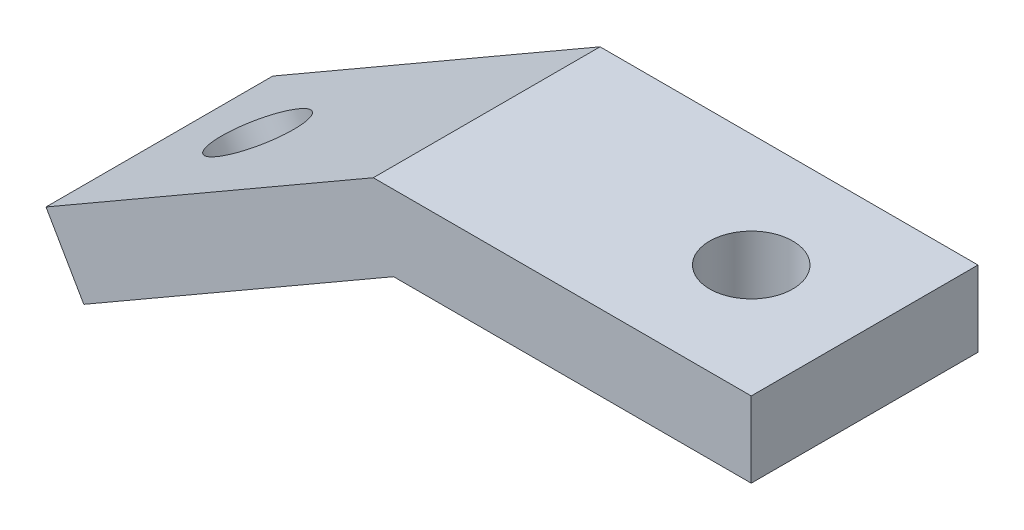
ISO-10303-21;
HEADER;
FILE_DESCRIPTION(('STEP AP214'),'2;1');
FILE_NAME('part.step','',(''),(''),'','','');
FILE_SCHEMA(('AUTOMOTIVE_DESIGN { 1 0 10303 214 1 1 1 1 }'));
ENDSEC;
DATA;
#1=APPLICATION_CONTEXT('core data for automotive mechanical design processes');
#2=APPLICATION_PROTOCOL_DEFINITION('international standard','automotive_design',2000,#1);
#3=PRODUCT_CONTEXT('',#1,'mechanical');
#4=PRODUCT('Part','Part','',(#3));
#5=PRODUCT_RELATED_PRODUCT_CATEGORY('part','',(#4));
#6=PRODUCT_DEFINITION_FORMATION('','',#4);
#7=PRODUCT_DEFINITION_CONTEXT('part definition',#1,'design');
#8=PRODUCT_DEFINITION('design','',#6,#7);
#9=PRODUCT_DEFINITION_SHAPE('','',#8);
#10=(LENGTH_UNIT() NAMED_UNIT(*) SI_UNIT(.MILLI.,.METRE.));
#11=(NAMED_UNIT(*) PLANE_ANGLE_UNIT() SI_UNIT($,.RADIAN.));
#12=(NAMED_UNIT(*) SI_UNIT($,.STERADIAN.) SOLID_ANGLE_UNIT());
#13=UNCERTAINTY_MEASURE_WITH_UNIT(LENGTH_MEASURE(1.E-05),#10,'distance_accuracy_value','');
#14=(GEOMETRIC_REPRESENTATION_CONTEXT(3) GLOBAL_UNCERTAINTY_ASSIGNED_CONTEXT((#13)) GLOBAL_UNIT_ASSIGNED_CONTEXT((#10,
#11,#12)) REPRESENTATION_CONTEXT('',''));
#15=CARTESIAN_POINT('',(0.,0.,0.));
#16=DIRECTION('',(0.,0.,1.));
#17=DIRECTION('',(1.,0.,0.));
#18=AXIS2_PLACEMENT_3D('',#15,#16,#17);
#19=CARTESIAN_POINT('',(-7.47461121881321,-2.07286672652779,6.));
#20=DIRECTION('',(0.866025403784438,0.500000000000002,0.));
#21=DIRECTION('',(-0.500000000000002,0.866025403784438,0.));
#22=AXIS2_PLACEMENT_3D('',#19,#20,#21);
#23=PLANE('',#22);
#24=DIRECTION('',(0.500000000000002,-0.866025403784438,0.));
#25=VECTOR('',#24,1.);
#26=CARTESIAN_POINT('',(-7.47461121881321,-2.07286672652779,0.));
#27=LINE('',#26,#25);
#28=CARTESIAN_POINT('',(-8.47461121881321,-0.340815918958912,0.));
#29=VERTEX_POINT('',#28);
#30=CARTESIAN_POINT('',(-7.47461121881321,-2.07286672652779,0.));
#31=VERTEX_POINT('',#30);
#32=EDGE_CURVE('E128',#29,#31,#27,.T.);
#33=ORIENTED_EDGE('',*,*,#32,.T.);
#34=DIRECTION('',(0.,0.,-1.));
#35=VECTOR('',#34,1.);
#36=CARTESIAN_POINT('',(-7.47461121881321,-2.07286672652779,6.));
#37=LINE('',#36,#35);
#38=CARTESIAN_POINT('',(-7.47461121881321,-2.07286672652779,6.));
#39=VERTEX_POINT('',#38);
#40=EDGE_CURVE('E11',#39,#31,#37,.T.);
#41=ORIENTED_EDGE('',*,*,#40,.F.);
#42=DIRECTION('',(0.500000000000002,-0.866025403784438,0.));
#43=VECTOR('',#42,1.);
#44=CARTESIAN_POINT('',(-7.47461121881321,-2.07286672652779,6.));
#45=LINE('',#44,#43);
#46=CARTESIAN_POINT('',(-8.47461121881321,-0.340815918958912,6.));
#47=VERTEX_POINT('',#46);
#48=EDGE_CURVE('E145',#47,#39,#45,.T.);
#49=ORIENTED_EDGE('',*,*,#48,.F.);
#50=DIRECTION('',(0.,0.,-1.));
#51=VECTOR('',#50,1.);
#52=CARTESIAN_POINT('',(-8.47461121881321,-0.340815918958912,6.));
#53=LINE('',#52,#51);
#54=EDGE_CURVE('E124',#47,#29,#53,.T.);
#55=ORIENTED_EDGE('',*,*,#54,.T.);
#56=EDGE_LOOP('',(#33,#41,#49,#55));
#57=FACE_BOUND('',#56,.T.);
#58=ADVANCED_FACE('F39',(#57),#23,.F.);
#59=CARTESIAN_POINT('',(0.721541203893412,2.6591840810411,6.));
#60=DIRECTION('',(-0.500000000000001,0.866025403784438,0.));
#61=DIRECTION('',(-0.866025403784438,-0.500000000000001,0.));
#62=AXIS2_PLACEMENT_3D('',#59,#60,#61);
#63=PLANE('',#62);
#64=CARTESIAN_POINT('',(-4.87653500745989,-0.572866726527783,3.));
#65=DIRECTION('',(-0.500000000000001,0.866025403784438,0.));
#66=DIRECTION('',(-0.866025403784438,-0.500000000000001,0.));
#67=AXIS2_PLACEMENT_3D('',#64,#65,#66);
#68=CIRCLE('',#67,1.1);
#69=CARTESIAN_POINT('',(-5.82916295162278,-1.12286672652779,3.));
#70=VERTEX_POINT('',#69);
#71=EDGE_CURVE('E249',#70,#70,#68,.T.);
#72=ORIENTED_EDGE('',*,*,#71,.T.);
#73=EDGE_LOOP('',(#72));
#74=FACE_BOUND('',#73,.T.);
#75=DIRECTION('',(0.866025403784438,0.500000000000001,0.));
#76=VECTOR('',#75,1.);
#77=CARTESIAN_POINT('',(0.721541203893412,2.6591840810411,0.));
#78=LINE('',#77,#76);
#79=CARTESIAN_POINT('',(0.721541203893412,2.6591840810411,0.));
#80=VERTEX_POINT('',#79);
#81=EDGE_CURVE('E132',#31,#80,#78,.T.);
#82=ORIENTED_EDGE('',*,*,#81,.T.);
#83=DIRECTION('',(0.,0.,-1.));
#84=VECTOR('',#83,1.);
#85=CARTESIAN_POINT('',(0.721541203893412,2.6591840810411,6.));
#86=LINE('',#85,#84);
#87=CARTESIAN_POINT('',(0.721541203893412,2.6591840810411,6.));
#88=VERTEX_POINT('',#87);
#89=EDGE_CURVE('E48',#88,#80,#86,.T.);
#90=ORIENTED_EDGE('',*,*,#89,.F.);
#91=DIRECTION('',(0.866025403784438,0.500000000000001,0.));
#92=VECTOR('',#91,1.);
#93=CARTESIAN_POINT('',(0.721541203893412,2.6591840810411,6.));
#94=LINE('',#93,#92);
#95=EDGE_CURVE('E93',#39,#88,#94,.T.);
#96=ORIENTED_EDGE('',*,*,#95,.F.);
#97=ORIENTED_EDGE('',*,*,#40,.T.);
#98=EDGE_LOOP('',(#82,#90,#96,#97));
#99=FACE_BOUND('',#98,.T.);
#100=ADVANCED_FACE('F176',(#74,#99),#63,.F.);
#101=CARTESIAN_POINT('',(10.1856428190312,2.6591840810411,6.));
#102=DIRECTION('',(0.,1.,0.));
#103=DIRECTION('',(-1.,0.,0.));
#104=AXIS2_PLACEMENT_3D('',#101,#102,#103);
#105=PLANE('',#104);
#106=CARTESIAN_POINT('',(7.18564281903117,2.6591840810411,3.));
#107=DIRECTION('',(0.,1.,0.));
#108=DIRECTION('',(-1.,0.,0.));
#109=AXIS2_PLACEMENT_3D('',#106,#107,#108);
#110=CIRCLE('',#109,1.1);
#111=CARTESIAN_POINT('',(6.08564281903117,2.6591840810411,3.));
#112=VERTEX_POINT('',#111);
#113=EDGE_CURVE('E133',#112,#112,#110,.T.);
#114=ORIENTED_EDGE('',*,*,#113,.T.);
#115=EDGE_LOOP('',(#114));
#116=FACE_BOUND('',#115,.T.);
#117=DIRECTION('',(1.,0.,0.));
#118=VECTOR('',#117,1.);
#119=CARTESIAN_POINT('',(10.1856428190312,2.6591840810411,0.));
#120=LINE('',#119,#118);
#121=CARTESIAN_POINT('',(10.1856428190312,2.6591840810411,0.));
#122=VERTEX_POINT('',#121);
#123=EDGE_CURVE('E136',#80,#122,#120,.T.);
#124=ORIENTED_EDGE('',*,*,#123,.T.);
#125=DIRECTION('',(0.,0.,-1.));
#126=VECTOR('',#125,1.);
#127=CARTESIAN_POINT('',(10.1856428190312,2.6591840810411,6.));
#128=LINE('',#127,#126);
#129=CARTESIAN_POINT('',(10.1856428190312,2.6591840810411,6.));
#130=VERTEX_POINT('',#129);
#131=EDGE_CURVE('E117',#130,#122,#128,.T.);
#132=ORIENTED_EDGE('',*,*,#131,.F.);
#133=DIRECTION('',(1.,0.,0.));
#134=VECTOR('',#133,1.);
#135=CARTESIAN_POINT('',(10.1856428190312,2.6591840810411,6.));
#136=LINE('',#135,#134);
#137=EDGE_CURVE('E106',#88,#130,#136,.T.);
#138=ORIENTED_EDGE('',*,*,#137,.F.);
#139=ORIENTED_EDGE('',*,*,#89,.T.);
#140=EDGE_LOOP('',(#124,#132,#138,#139));
#141=FACE_BOUND('',#140,.T.);
#142=ADVANCED_FACE('F155',(#116,#141),#105,.F.);
#143=CARTESIAN_POINT('',(10.1856428190312,4.6591840810411,6.));
#144=DIRECTION('',(-1.,0.,0.));
#145=DIRECTION('',(0.,-1.,0.));
#146=AXIS2_PLACEMENT_3D('',#143,#144,#145);
#147=PLANE('',#146);
#148=DIRECTION('',(0.,1.,0.));
#149=VECTOR('',#148,1.);
#150=CARTESIAN_POINT('',(10.1856428190312,4.6591840810411,0.));
#151=LINE('',#150,#149);
#152=CARTESIAN_POINT('',(10.1856428190312,4.6591840810411,0.));
#153=VERTEX_POINT('',#152);
#154=EDGE_CURVE('E115',#122,#153,#151,.T.);
#155=ORIENTED_EDGE('',*,*,#154,.T.);
#156=DIRECTION('',(0.,0.,-1.));
#157=VECTOR('',#156,1.);
#158=CARTESIAN_POINT('',(10.1856428190312,4.6591840810411,6.));
#159=LINE('',#158,#157);
#160=CARTESIAN_POINT('',(10.1856428190312,4.6591840810411,6.));
#161=VERTEX_POINT('',#160);
#162=EDGE_CURVE('E112',#161,#153,#159,.T.);
#163=ORIENTED_EDGE('',*,*,#162,.F.);
#164=DIRECTION('',(0.,1.,0.));
#165=VECTOR('',#164,1.);
#166=CARTESIAN_POINT('',(10.1856428190312,4.6591840810411,6.));
#167=LINE('',#166,#165);
#168=EDGE_CURVE('E100',#130,#161,#167,.T.);
#169=ORIENTED_EDGE('',*,*,#168,.F.);
#170=ORIENTED_EDGE('',*,*,#131,.T.);
#171=EDGE_LOOP('',(#155,#163,#169,#170));
#172=FACE_BOUND('',#171,.T.);
#173=ADVANCED_FACE('F113',(#172),#147,.F.);
#174=CARTESIAN_POINT('',(0.185642819031173,4.6591840810411,6.));
#175=DIRECTION('',(0.,-1.,0.));
#176=DIRECTION('',(1.,0.,0.));
#177=AXIS2_PLACEMENT_3D('',#174,#175,#176);
#178=PLANE('',#177);
#179=CARTESIAN_POINT('',(7.18564281903117,4.6591840810411,3.));
#180=DIRECTION('',(0.,1.,0.));
#181=DIRECTION('',(-1.,0.,0.));
#182=AXIS2_PLACEMENT_3D('',#179,#180,#181);
#183=CIRCLE('',#182,1.1);
#184=CARTESIAN_POINT('',(6.08564281903117,4.6591840810411,3.));
#185=VERTEX_POINT('',#184);
#186=EDGE_CURVE('E251',#185,#185,#183,.T.);
#187=ORIENTED_EDGE('',*,*,#186,.F.);
#188=EDGE_LOOP('',(#187));
#189=FACE_BOUND('',#188,.T.);
#190=DIRECTION('',(-1.,0.,0.));
#191=VECTOR('',#190,1.);
#192=CARTESIAN_POINT('',(0.185642819031173,4.6591840810411,0.));
#193=LINE('',#192,#191);
#194=CARTESIAN_POINT('',(0.185642819031173,4.6591840810411,0.));
#195=VERTEX_POINT('',#194);
#196=EDGE_CURVE('E79',#153,#195,#193,.T.);
#197=ORIENTED_EDGE('',*,*,#196,.T.);
#198=DIRECTION('',(0.,0.,-1.));
#199=VECTOR('',#198,1.);
#200=CARTESIAN_POINT('',(0.185642819031173,4.6591840810411,6.));
#201=LINE('',#200,#199);
#202=CARTESIAN_POINT('',(0.185642819031173,4.6591840810411,6.));
#203=VERTEX_POINT('',#202);
#204=EDGE_CURVE('E118',#203,#195,#201,.T.);
#205=ORIENTED_EDGE('',*,*,#204,.F.);
#206=DIRECTION('',(-1.,0.,0.));
#207=VECTOR('',#206,1.);
#208=CARTESIAN_POINT('',(0.185642819031173,4.6591840810411,6.));
#209=LINE('',#208,#207);
#210=EDGE_CURVE('E104',#161,#203,#209,.T.);
#211=ORIENTED_EDGE('',*,*,#210,.F.);
#212=ORIENTED_EDGE('',*,*,#162,.T.);
#213=EDGE_LOOP('',(#197,#205,#211,#212));
#214=FACE_BOUND('',#213,.T.);
#215=ADVANCED_FACE('F120',(#189,#214),#178,.F.);
#216=CARTESIAN_POINT('',(-8.47461121881321,-0.340815918958912,6.));
#217=DIRECTION('',(0.500000000000001,-0.866025403784438,0.));
#218=DIRECTION('',(0.866025403784438,0.500000000000001,0.));
#219=AXIS2_PLACEMENT_3D('',#216,#217,#218);
#220=PLANE('',#219);
#221=CARTESIAN_POINT('',(-5.8765350074599,1.15918408104109,3.));
#222=DIRECTION('',(-0.500000000000001,0.866025403784438,0.));
#223=DIRECTION('',(-0.866025403784438,-0.500000000000001,0.));
#224=AXIS2_PLACEMENT_3D('',#221,#222,#223);
#225=CIRCLE('',#224,1.1);
#226=CARTESIAN_POINT('',(-6.82916295162278,0.60918408104109,3.));
#227=VERTEX_POINT('',#226);
#228=EDGE_CURVE('E247',#227,#227,#225,.T.);
#229=ORIENTED_EDGE('',*,*,#228,.F.);
#230=EDGE_LOOP('',(#229));
#231=FACE_BOUND('',#230,.T.);
#232=DIRECTION('',(-0.866025403784438,-0.500000000000001,0.));
#233=VECTOR('',#232,1.);
#234=CARTESIAN_POINT('',(-8.47461121881321,-0.340815918958912,0.));
#235=LINE('',#234,#233);
#236=EDGE_CURVE('E85',#195,#29,#235,.T.);
#237=ORIENTED_EDGE('',*,*,#236,.T.);
#238=ORIENTED_EDGE('',*,*,#54,.F.);
#239=DIRECTION('',(-0.866025403784438,-0.500000000000001,0.));
#240=VECTOR('',#239,1.);
#241=CARTESIAN_POINT('',(-8.47461121881321,-0.340815918958912,6.));
#242=LINE('',#241,#240);
#243=EDGE_CURVE('E56',#203,#47,#242,.T.);
#244=ORIENTED_EDGE('',*,*,#243,.F.);
#245=ORIENTED_EDGE('',*,*,#204,.T.);
#246=EDGE_LOOP('',(#237,#238,#244,#245));
#247=FACE_BOUND('',#246,.T.);
#248=ADVANCED_FACE('F162',(#231,#247),#220,.F.);
#249=CARTESIAN_POINT('',(0.,0.,6.));
#250=DIRECTION('',(0.,0.,-1.));
#251=DIRECTION('',(-1.,0.,0.));
#252=AXIS2_PLACEMENT_3D('',#249,#250,#251);
#253=PLANE('',#252);
#254=ORIENTED_EDGE('',*,*,#48,.T.);
#255=ORIENTED_EDGE('',*,*,#95,.T.);
#256=ORIENTED_EDGE('',*,*,#137,.T.);
#257=ORIENTED_EDGE('',*,*,#168,.T.);
#258=ORIENTED_EDGE('',*,*,#210,.T.);
#259=ORIENTED_EDGE('',*,*,#243,.T.);
#260=EDGE_LOOP('',(#254,#255,#256,#257,#258,#259));
#261=FACE_BOUND('',#260,.T.);
#262=ADVANCED_FACE('F102',(#261),#253,.F.);
#263=CARTESIAN_POINT('',(0.,0.,0.));
#264=DIRECTION('',(0.,0.,-1.));
#265=DIRECTION('',(-1.,0.,0.));
#266=AXIS2_PLACEMENT_3D('',#263,#264,#265);
#267=PLANE('',#266);
#268=ORIENTED_EDGE('',*,*,#32,.F.);
#269=ORIENTED_EDGE('',*,*,#236,.F.);
#270=ORIENTED_EDGE('',*,*,#196,.F.);
#271=ORIENTED_EDGE('',*,*,#154,.F.);
#272=ORIENTED_EDGE('',*,*,#123,.F.);
#273=ORIENTED_EDGE('',*,*,#81,.F.);
#274=EDGE_LOOP('',(#268,#269,#270,#271,#272,#273));
#275=FACE_BOUND('',#274,.T.);
#276=ADVANCED_FACE('F158',(#275),#267,.T.);
#277=CARTESIAN_POINT('',(7.18564281903117,-1.3408159189589,3.));
#278=DIRECTION('',(0.,1.,0.));
#279=DIRECTION('',(-1.,0.,0.));
#280=AXIS2_PLACEMENT_3D('',#277,#278,#279);
#281=CYLINDRICAL_SURFACE('',#280,1.1);
#282=ORIENTED_EDGE('',*,*,#186,.T.);
#283=EDGE_LOOP('',(#282));
#284=FACE_BOUND('',#283,.T.);
#285=ORIENTED_EDGE('',*,*,#113,.F.);
#286=EDGE_LOOP('',(#285));
#287=FACE_BOUND('',#286,.T.);
#288=ADVANCED_FACE('F207',(#284,#287),#281,.F.);
#289=CARTESIAN_POINT('',(-2.87653500745989,-4.03696834166554,3.));
#290=DIRECTION('',(-0.500000000000001,0.866025403784438,0.));
#291=DIRECTION('',(-0.866025403784438,-0.500000000000001,0.));
#292=AXIS2_PLACEMENT_3D('',#289,#290,#291);
#293=CYLINDRICAL_SURFACE('',#292,1.1);
#294=ORIENTED_EDGE('',*,*,#228,.T.);
#295=EDGE_LOOP('',(#294));
#296=FACE_BOUND('',#295,.T.);
#297=ORIENTED_EDGE('',*,*,#71,.F.);
#298=EDGE_LOOP('',(#297));
#299=FACE_BOUND('',#298,.T.);
#300=ADVANCED_FACE('F211',(#296,#299),#293,.F.);
#301=CLOSED_SHELL('',(#58,#100,#142,#173,#215,#248,#262,#276,#288,#300));
#302=MANIFOLD_SOLID_BREP('B2',#301);
#303=ADVANCED_BREP_SHAPE_REPRESENTATION('',(#18,#302),#14);
#304=SHAPE_DEFINITION_REPRESENTATION(#9,#303);
ENDSEC;
END-ISO-10303-21;
